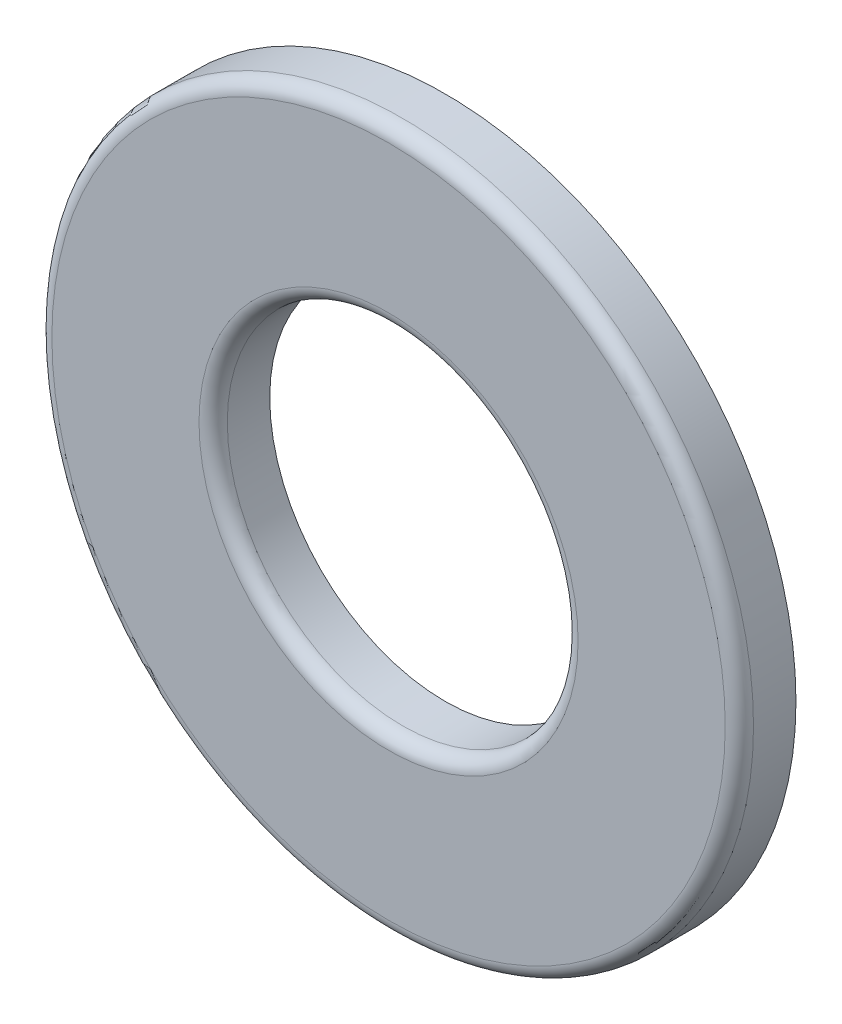
ISO-10303-21;
HEADER;
FILE_DESCRIPTION(('STEP AP214'),'2;1');
FILE_NAME('part.step','',(''),(''),'','','');
FILE_SCHEMA(('AUTOMOTIVE_DESIGN { 1 0 10303 214 1 1 1 1 }'));
ENDSEC;
DATA;
#1=APPLICATION_CONTEXT('core data for automotive mechanical design processes');
#2=APPLICATION_PROTOCOL_DEFINITION('international standard','automotive_design',2000,#1);
#3=PRODUCT_CONTEXT('',#1,'mechanical');
#4=PRODUCT('Part','Part','',(#3));
#5=PRODUCT_RELATED_PRODUCT_CATEGORY('part','',(#4));
#6=PRODUCT_DEFINITION_FORMATION('','',#4);
#7=PRODUCT_DEFINITION_CONTEXT('part definition',#1,'design');
#8=PRODUCT_DEFINITION('design','',#6,#7);
#9=PRODUCT_DEFINITION_SHAPE('','',#8);
#10=(LENGTH_UNIT() NAMED_UNIT(*) SI_UNIT(.MILLI.,.METRE.));
#11=(NAMED_UNIT(*) PLANE_ANGLE_UNIT() SI_UNIT($,.RADIAN.));
#12=(NAMED_UNIT(*) SI_UNIT($,.STERADIAN.) SOLID_ANGLE_UNIT());
#13=UNCERTAINTY_MEASURE_WITH_UNIT(LENGTH_MEASURE(1.E-05),#10,'distance_accuracy_value','');
#14=(GEOMETRIC_REPRESENTATION_CONTEXT(3) GLOBAL_UNCERTAINTY_ASSIGNED_CONTEXT((#13)) GLOBAL_UNIT_ASSIGNED_CONTEXT((#10,
#11,#12)) REPRESENTATION_CONTEXT('',''));
#15=CARTESIAN_POINT('',(0.,0.,0.));
#16=DIRECTION('',(0.,0.,1.));
#17=DIRECTION('',(1.,0.,0.));
#18=AXIS2_PLACEMENT_3D('',#15,#16,#17);
#19=CARTESIAN_POINT('',(0.,0.,0.831849999999998));
#20=DIRECTION('',(0.,0.,1.));
#21=DIRECTION('',(1.,0.,0.));
#22=AXIS2_PLACEMENT_3D('',#19,#20,#21);
#23=PLANE('',#22);
#24=CARTESIAN_POINT('',(0.,0.,0.831849999999998));
#25=DIRECTION('',(0.,0.,1.));
#26=DIRECTION('',(1.,0.,0.));
#27=AXIS2_PLACEMENT_3D('',#24,#25,#26);
#28=CIRCLE('',#27,9.896475);
#29=CARTESIAN_POINT('',(9.896475,0.,0.831849999999998));
#30=VERTEX_POINT('',#29);
#31=EDGE_CURVE('E48',#30,#30,#28,.T.);
#32=ORIENTED_EDGE('',*,*,#31,.T.);
#33=EDGE_LOOP('',(#32));
#34=FACE_BOUND('',#33,.T.);
#35=CARTESIAN_POINT('',(0.,0.,0.831849999999998));
#36=DIRECTION('',(0.,0.,1.));
#37=DIRECTION('',(1.,0.,0.));
#38=AXIS2_PLACEMENT_3D('',#35,#36,#37);
#39=CIRCLE('',#38,5.572125);
#40=CARTESIAN_POINT('',(5.572125,0.,0.831849999999998));
#41=VERTEX_POINT('',#40);
#42=EDGE_CURVE('E52',#41,#41,#39,.F.);
#43=ORIENTED_EDGE('',*,*,#42,.T.);
#44=EDGE_LOOP('',(#43));
#45=FACE_BOUND('',#44,.T.);
#46=ADVANCED_FACE('F37',(#34,#45),#23,.T.);
#47=CARTESIAN_POINT('',(0.,0.,0.831849999999998));
#48=DIRECTION('',(0.,0.,-1.));
#49=DIRECTION('',(-1.,0.,0.));
#50=AXIS2_PLACEMENT_3D('',#47,#48,#49);
#51=CYLINDRICAL_SURFACE('',#50,10.3124);
#52=CARTESIAN_POINT('',(0.,0.,0.415924999999998));
#53=DIRECTION('',(0.,0.,1.));
#54=DIRECTION('',(1.,0.,0.));
#55=AXIS2_PLACEMENT_3D('',#52,#53,#54);
#56=CIRCLE('',#55,10.3124);
#57=CARTESIAN_POINT('',(-10.3124,0.,0.415924999999998));
#58=VERTEX_POINT('',#57);
#59=EDGE_CURVE('E44',#58,#58,#56,.F.);
#60=CARTESIAN_POINT('',(0.,0.,-0.831850000000002));
#61=DIRECTION('',(0.,0.,1.));
#62=DIRECTION('',(1.,0.,0.));
#63=AXIS2_PLACEMENT_3D('',#60,#61,#62);
#64=CIRCLE('',#63,10.3124);
#65=CARTESIAN_POINT('',(-10.3124,0.,-0.831850000000002));
#66=VERTEX_POINT('',#65);
#67=EDGE_CURVE('E57',#66,#66,#64,.T.);
#68=CARTESIAN_POINT('',(-10.3124,0.,0.415924999999998));
#69=CARTESIAN_POINT('',(-10.3124,0.,0.402927343749999));
#70=CARTESIAN_POINT('',(-10.3124,0.,0.389929687499998));
#71=CARTESIAN_POINT('',(-10.3124,0.,0.363934374999998));
#72=CARTESIAN_POINT('',(-10.3124,0.,0.350936718749999));
#73=CARTESIAN_POINT('',(-10.3124,0.,0.324941406249999));
#74=CARTESIAN_POINT('',(-10.3124,0.,0.311943749999999));
#75=CARTESIAN_POINT('',(-10.3124,0.,0.285948437499999));
#76=CARTESIAN_POINT('',(-10.3124,0.,0.272950781249998));
#77=CARTESIAN_POINT('',(-10.3124,0.,0.246955468749998));
#78=CARTESIAN_POINT('',(-10.3124,0.,0.233957812499998));
#79=CARTESIAN_POINT('',(-10.3124,0.,0.207962499999998));
#80=CARTESIAN_POINT('',(-10.3124,0.,0.194964843749999));
#81=CARTESIAN_POINT('',(-10.3124,0.,0.168969531249999));
#82=CARTESIAN_POINT('',(-10.3124,0.,0.155971874999999));
#83=CARTESIAN_POINT('',(-10.3124,0.,0.129976562499999));
#84=CARTESIAN_POINT('',(-10.3124,0.,0.116978906249999));
#85=CARTESIAN_POINT('',(-10.3124,0.,0.0909835937499985));
#86=CARTESIAN_POINT('',(-10.3124,0.,0.0779859374999985));
#87=CARTESIAN_POINT('',(-10.3124,0.,0.0519906249999985));
#88=CARTESIAN_POINT('',(-10.3124,0.,0.0389929687499985));
#89=CARTESIAN_POINT('',(-10.3124,0.,0.0129976562499985));
#90=CARTESIAN_POINT('',(-10.3124,0.,0.));
#91=CARTESIAN_POINT('',(-10.3124,0.,-0.0259953125000014));
#92=CARTESIAN_POINT('',(-10.3124,0.,-0.0389929687500014));
#93=CARTESIAN_POINT('',(-10.3124,0.,-0.0649882812500015));
#94=CARTESIAN_POINT('',(-10.3124,0.,-0.0779859375000015));
#95=CARTESIAN_POINT('',(-10.3124,0.,-0.103981250000002));
#96=CARTESIAN_POINT('',(-10.3124,0.,-0.116978906250002));
#97=CARTESIAN_POINT('',(-10.3124,0.,-0.142974218750002));
#98=CARTESIAN_POINT('',(-10.3124,0.,-0.155971875000001));
#99=CARTESIAN_POINT('',(-10.3124,0.,-0.181967187500001));
#100=CARTESIAN_POINT('',(-10.3124,0.,-0.194964843750001));
#101=CARTESIAN_POINT('',(-10.3124,0.,-0.220960156250001));
#102=CARTESIAN_POINT('',(-10.3124,0.,-0.233957812500001));
#103=CARTESIAN_POINT('',(-10.3124,0.,-0.259953125000001));
#104=CARTESIAN_POINT('',(-10.3124,0.,-0.272950781250001));
#105=CARTESIAN_POINT('',(-10.3124,0.,-0.298946093750001));
#106=CARTESIAN_POINT('',(-10.3124,0.,-0.311943750000001));
#107=CARTESIAN_POINT('',(-10.3124,0.,-0.337939062500001));
#108=CARTESIAN_POINT('',(-10.3124,0.,-0.350936718750001));
#109=CARTESIAN_POINT('',(-10.3124,0.,-0.376932031250001));
#110=CARTESIAN_POINT('',(-10.3124,0.,-0.389929687500001));
#111=CARTESIAN_POINT('',(-10.3124,0.,-0.415925000000001));
#112=CARTESIAN_POINT('',(-10.3124,0.,-0.428922656250001));
#113=CARTESIAN_POINT('',(-10.3124,0.,-0.454917968750001));
#114=CARTESIAN_POINT('',(-10.3124,0.,-0.467915625000001));
#115=CARTESIAN_POINT('',(-10.3124,0.,-0.493910937500001));
#116=CARTESIAN_POINT('',(-10.3124,0.,-0.506908593750001));
#117=CARTESIAN_POINT('',(-10.3124,0.,-0.532903906250001));
#118=CARTESIAN_POINT('',(-10.3124,0.,-0.545901562500001));
#119=CARTESIAN_POINT('',(-10.3124,0.,-0.571896875000001));
#120=CARTESIAN_POINT('',(-10.3124,0.,-0.584894531250002));
#121=CARTESIAN_POINT('',(-10.3124,0.,-0.610889843750001));
#122=CARTESIAN_POINT('',(-10.3124,0.,-0.623887500000001));
#123=CARTESIAN_POINT('',(-10.3124,0.,-0.649882812500001));
#124=CARTESIAN_POINT('',(-10.3124,0.,-0.662880468750002));
#125=CARTESIAN_POINT('',(-10.3124,0.,-0.688875781250001));
#126=CARTESIAN_POINT('',(-10.3124,0.,-0.701873437500001));
#127=CARTESIAN_POINT('',(-10.3124,0.,-0.727868750000001));
#128=CARTESIAN_POINT('',(-10.3124,0.,-0.740866406250001));
#129=CARTESIAN_POINT('',(-10.3124,0.,-0.766861718750001));
#130=CARTESIAN_POINT('',(-10.3124,0.,-0.779859375000001));
#131=CARTESIAN_POINT('',(-10.3124,0.,-0.805854687500001));
#132=CARTESIAN_POINT('',(-10.3124,0.,-0.818852343750001));
#133=CARTESIAN_POINT('',(-10.3124,0.,-0.831850000000002));
#134=B_SPLINE_CURVE_WITH_KNOTS('',3,(#68,#69,#70,#71,#72,#73,#74,#75,#76,#77,#78,#79,#80,#81,
#82,#83,#84,#85,#86,#87,#88,#89,#90,#91,#92,#93,#94,#95,#96,#97,#98,#99,#100,#101,#102,#103,
#104,#105,#106,#107,#108,#109,#110,#111,#112,#113,#114,#115,#116,#117,#118,#119,#120,#121,#122,
#123,#124,#125,#126,#127,#128,#129,#130,#131,#132,#133),.UNSPECIFIED.,.F.,.F.,(4,2,2,2,2,2,2,2,
2,2,2,2,2,2,2,2,2,2,2,2,2,2,2,2,2,2,2,2,2,2,2,2,4),(0.,0.03899296875,0.0779859374999999,
0.11697890625,0.155971875,0.19496484375,0.2339578125,0.27295078125,0.31194375,0.35093671875,
0.3899296875,0.42892265625,0.467915625,0.50690859375,0.5459015625,0.58489453125,0.6238875,
0.66288046875,0.7018734375,0.74086640625,0.779859375,0.81885234375,0.8578453125,0.89683828125,
0.93583125,0.97482421875,1.0138171875,1.05281015625,1.091803125,1.13079609375,1.1697890625,
1.20878203125,1.247775),.UNSPECIFIED.);
#135=EDGE_CURVE('BSEAM69',#58,#66,#134,.T.);
#136=ORIENTED_EDGE('',*,*,#59,.T.);
#137=ORIENTED_EDGE('',*,*,#67,.T.);
#138=ORIENTED_EDGE('',*,*,#135,.T.);
#139=ORIENTED_EDGE('',*,*,#135,.F.);
#140=EDGE_LOOP('',(#136,#138,#137,#139));
#141=FACE_BOUND('',#140,.T.);
#142=ADVANCED_FACE('F69',(#141),#51,.T.);
#143=CARTESIAN_POINT('',(0.,0.,0.831849999999998));
#144=DIRECTION('',(0.,0.,-1.));
#145=DIRECTION('',(-1.,0.,0.));
#146=AXIS2_PLACEMENT_3D('',#143,#144,#145);
#147=CYLINDRICAL_SURFACE('',#146,5.1562);
#148=CARTESIAN_POINT('',(0.,0.,0.415924999999998));
#149=DIRECTION('',(0.,0.,1.));
#150=DIRECTION('',(1.,0.,0.));
#151=AXIS2_PLACEMENT_3D('',#148,#149,#150);
#152=CIRCLE('',#151,5.1562);
#153=CARTESIAN_POINT('',(-5.1562,0.,0.415924999999998));
#154=VERTEX_POINT('',#153);
#155=EDGE_CURVE('E10',#154,#154,#152,.T.);
#156=CARTESIAN_POINT('',(0.,0.,-0.831850000000002));
#157=DIRECTION('',(0.,0.,1.));
#158=DIRECTION('',(1.,0.,0.));
#159=AXIS2_PLACEMENT_3D('',#156,#157,#158);
#160=CIRCLE('',#159,5.1562);
#161=CARTESIAN_POINT('',(-5.1562,0.,-0.831850000000002));
#162=VERTEX_POINT('',#161);
#163=EDGE_CURVE('E60',#162,#162,#160,.T.);
#164=CARTESIAN_POINT('',(-5.1562,0.,0.415924999999998));
#165=CARTESIAN_POINT('',(-5.1562,0.,0.402927343749999));
#166=CARTESIAN_POINT('',(-5.1562,0.,0.389929687499998));
#167=CARTESIAN_POINT('',(-5.1562,0.,0.363934374999998));
#168=CARTESIAN_POINT('',(-5.1562,0.,0.350936718749999));
#169=CARTESIAN_POINT('',(-5.1562,0.,0.324941406249999));
#170=CARTESIAN_POINT('',(-5.1562,0.,0.311943749999999));
#171=CARTESIAN_POINT('',(-5.1562,0.,0.285948437499999));
#172=CARTESIAN_POINT('',(-5.1562,0.,0.272950781249998));
#173=CARTESIAN_POINT('',(-5.1562,0.,0.246955468749998));
#174=CARTESIAN_POINT('',(-5.1562,0.,0.233957812499998));
#175=CARTESIAN_POINT('',(-5.1562,0.,0.207962499999998));
#176=CARTESIAN_POINT('',(-5.1562,0.,0.194964843749999));
#177=CARTESIAN_POINT('',(-5.1562,0.,0.168969531249999));
#178=CARTESIAN_POINT('',(-5.1562,0.,0.155971874999999));
#179=CARTESIAN_POINT('',(-5.1562,0.,0.129976562499999));
#180=CARTESIAN_POINT('',(-5.1562,0.,0.116978906249999));
#181=CARTESIAN_POINT('',(-5.1562,0.,0.0909835937499985));
#182=CARTESIAN_POINT('',(-5.1562,0.,0.0779859374999985));
#183=CARTESIAN_POINT('',(-5.1562,0.,0.0519906249999985));
#184=CARTESIAN_POINT('',(-5.1562,0.,0.0389929687499985));
#185=CARTESIAN_POINT('',(-5.1562,0.,0.0129976562499985));
#186=CARTESIAN_POINT('',(-5.1562,0.,0.));
#187=CARTESIAN_POINT('',(-5.1562,0.,-0.0259953125000014));
#188=CARTESIAN_POINT('',(-5.1562,0.,-0.0389929687500014));
#189=CARTESIAN_POINT('',(-5.1562,0.,-0.0649882812500015));
#190=CARTESIAN_POINT('',(-5.1562,0.,-0.0779859375000015));
#191=CARTESIAN_POINT('',(-5.1562,0.,-0.103981250000002));
#192=CARTESIAN_POINT('',(-5.1562,0.,-0.116978906250002));
#193=CARTESIAN_POINT('',(-5.1562,0.,-0.142974218750002));
#194=CARTESIAN_POINT('',(-5.1562,0.,-0.155971875000001));
#195=CARTESIAN_POINT('',(-5.1562,0.,-0.181967187500001));
#196=CARTESIAN_POINT('',(-5.1562,0.,-0.194964843750001));
#197=CARTESIAN_POINT('',(-5.1562,0.,-0.220960156250001));
#198=CARTESIAN_POINT('',(-5.1562,0.,-0.233957812500001));
#199=CARTESIAN_POINT('',(-5.1562,0.,-0.259953125000001));
#200=CARTESIAN_POINT('',(-5.1562,0.,-0.272950781250001));
#201=CARTESIAN_POINT('',(-5.1562,0.,-0.298946093750001));
#202=CARTESIAN_POINT('',(-5.1562,0.,-0.311943750000001));
#203=CARTESIAN_POINT('',(-5.1562,0.,-0.337939062500001));
#204=CARTESIAN_POINT('',(-5.1562,0.,-0.350936718750001));
#205=CARTESIAN_POINT('',(-5.1562,0.,-0.376932031250001));
#206=CARTESIAN_POINT('',(-5.1562,0.,-0.389929687500001));
#207=CARTESIAN_POINT('',(-5.1562,0.,-0.415925000000001));
#208=CARTESIAN_POINT('',(-5.1562,0.,-0.428922656250001));
#209=CARTESIAN_POINT('',(-5.1562,0.,-0.454917968750001));
#210=CARTESIAN_POINT('',(-5.1562,0.,-0.467915625000001));
#211=CARTESIAN_POINT('',(-5.1562,0.,-0.493910937500001));
#212=CARTESIAN_POINT('',(-5.1562,0.,-0.506908593750001));
#213=CARTESIAN_POINT('',(-5.1562,0.,-0.532903906250001));
#214=CARTESIAN_POINT('',(-5.1562,0.,-0.545901562500001));
#215=CARTESIAN_POINT('',(-5.1562,0.,-0.571896875000001));
#216=CARTESIAN_POINT('',(-5.1562,0.,-0.584894531250002));
#217=CARTESIAN_POINT('',(-5.1562,0.,-0.610889843750001));
#218=CARTESIAN_POINT('',(-5.1562,0.,-0.623887500000001));
#219=CARTESIAN_POINT('',(-5.1562,0.,-0.649882812500001));
#220=CARTESIAN_POINT('',(-5.1562,0.,-0.662880468750002));
#221=CARTESIAN_POINT('',(-5.1562,0.,-0.688875781250001));
#222=CARTESIAN_POINT('',(-5.1562,0.,-0.701873437500001));
#223=CARTESIAN_POINT('',(-5.1562,0.,-0.727868750000001));
#224=CARTESIAN_POINT('',(-5.1562,0.,-0.740866406250001));
#225=CARTESIAN_POINT('',(-5.1562,0.,-0.766861718750001));
#226=CARTESIAN_POINT('',(-5.1562,0.,-0.779859375000001));
#227=CARTESIAN_POINT('',(-5.1562,0.,-0.805854687500001));
#228=CARTESIAN_POINT('',(-5.1562,0.,-0.818852343750001));
#229=CARTESIAN_POINT('',(-5.1562,0.,-0.831850000000002));
#230=B_SPLINE_CURVE_WITH_KNOTS('',3,(#164,#165,#166,#167,#168,#169,#170,#171,#172,#173,#174,
#175,#176,#177,#178,#179,#180,#181,#182,#183,#184,#185,#186,#187,#188,#189,#190,#191,#192,#193,
#194,#195,#196,#197,#198,#199,#200,#201,#202,#203,#204,#205,#206,#207,#208,#209,#210,#211,#212,
#213,#214,#215,#216,#217,#218,#219,#220,#221,#222,#223,#224,#225,#226,#227,#228,#229),
.UNSPECIFIED.,.F.,.F.,(4,2,2,2,2,2,2,2,2,2,2,2,2,2,2,2,2,2,2,2,2,2,2,2,2,2,2,2,2,2,2,2,4),(0.,
0.03899296875,0.0779859374999999,0.11697890625,0.155971875,0.19496484375,0.2339578125,
0.27295078125,0.31194375,0.35093671875,0.3899296875,0.42892265625,0.467915625,0.50690859375,
0.5459015625,0.58489453125,0.6238875,0.66288046875,0.7018734375,0.74086640625,0.779859375,
0.81885234375,0.8578453125,0.89683828125,0.93583125,0.97482421875,1.0138171875,1.05281015625,
1.091803125,1.13079609375,1.1697890625,1.20878203125,1.247775),.UNSPECIFIED.);
#231=EDGE_CURVE('BSEAM67',#154,#162,#230,.T.);
#232=ORIENTED_EDGE('',*,*,#155,.T.);
#233=ORIENTED_EDGE('',*,*,#163,.F.);
#234=ORIENTED_EDGE('',*,*,#231,.T.);
#235=ORIENTED_EDGE('',*,*,#231,.F.);
#236=EDGE_LOOP('',(#232,#234,#233,#235));
#237=FACE_BOUND('',#236,.T.);
#238=ADVANCED_FACE('F67',(#237),#147,.F.);
#239=CARTESIAN_POINT('',(0.,0.,-0.831850000000002));
#240=DIRECTION('',(0.,0.,1.));
#241=DIRECTION('',(1.,0.,0.));
#242=AXIS2_PLACEMENT_3D('',#239,#240,#241);
#243=PLANE('',#242);
#244=ORIENTED_EDGE('',*,*,#163,.T.);
#245=EDGE_LOOP('',(#244));
#246=FACE_BOUND('',#245,.T.);
#247=ORIENTED_EDGE('',*,*,#67,.F.);
#248=EDGE_LOOP('',(#247));
#249=FACE_BOUND('',#248,.T.);
#250=ADVANCED_FACE('F64',(#246,#249),#243,.F.);
#251=CARTESIAN_POINT('',(0.,0.,0.415924999999998));
#252=DIRECTION('',(0.,0.,1.));
#253=DIRECTION('',(1.,0.,0.));
#254=AXIS2_PLACEMENT_3D('',#251,#252,#253);
#255=TOROIDAL_SURFACE('',#254,9.896475,0.415925);
#256=ORIENTED_EDGE('',*,*,#59,.F.);
#257=EDGE_LOOP('',(#256));
#258=FACE_BOUND('',#257,.T.);
#259=ORIENTED_EDGE('',*,*,#31,.F.);
#260=EDGE_LOOP('',(#259));
#261=FACE_BOUND('',#260,.T.);
#262=ADVANCED_FACE('F76',(#258,#261),#255,.T.);
#263=CARTESIAN_POINT('',(0.,0.,0.415924999999998));
#264=DIRECTION('',(0.,0.,1.));
#265=DIRECTION('',(1.,0.,0.));
#266=AXIS2_PLACEMENT_3D('',#263,#264,#265);
#267=TOROIDAL_SURFACE('',#266,5.572125,0.415925);
#268=ORIENTED_EDGE('',*,*,#42,.F.);
#269=EDGE_LOOP('',(#268));
#270=FACE_BOUND('',#269,.T.);
#271=ORIENTED_EDGE('',*,*,#155,.F.);
#272=EDGE_LOOP('',(#271));
#273=FACE_BOUND('',#272,.T.);
#274=ADVANCED_FACE('F39',(#270,#273),#267,.T.);
#275=CLOSED_SHELL('',(#46,#142,#238,#250,#262,#274));
#276=MANIFOLD_SOLID_BREP('B2',#275);
#277=ADVANCED_BREP_SHAPE_REPRESENTATION('',(#18,#276),#14);
#278=SHAPE_DEFINITION_REPRESENTATION(#9,#277);
ENDSEC;
END-ISO-10303-21;
